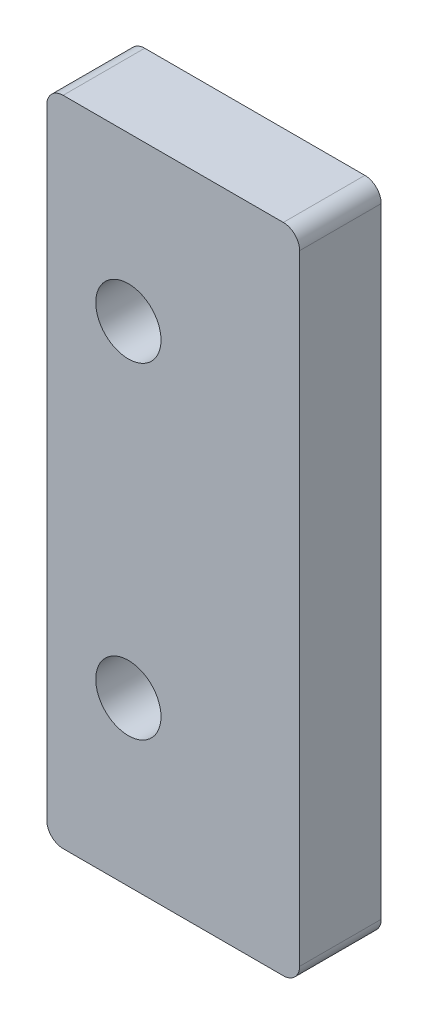
ISO-10303-21;
HEADER;
FILE_DESCRIPTION(('STEP AP214'),'2;1');
FILE_NAME('part.step','',(''),(''),'','','');
FILE_SCHEMA(('AUTOMOTIVE_DESIGN { 1 0 10303 214 1 1 1 1 }'));
ENDSEC;
DATA;
#1=APPLICATION_CONTEXT('core data for automotive mechanical design processes');
#2=APPLICATION_PROTOCOL_DEFINITION('international standard','automotive_design',2000,#1);
#3=PRODUCT_CONTEXT('',#1,'mechanical');
#4=PRODUCT('Part','Part','',(#3));
#5=PRODUCT_RELATED_PRODUCT_CATEGORY('part','',(#4));
#6=PRODUCT_DEFINITION_FORMATION('','',#4);
#7=PRODUCT_DEFINITION_CONTEXT('part definition',#1,'design');
#8=PRODUCT_DEFINITION('design','',#6,#7);
#9=PRODUCT_DEFINITION_SHAPE('','',#8);
#10=(LENGTH_UNIT() NAMED_UNIT(*) SI_UNIT(.MILLI.,.METRE.));
#11=(NAMED_UNIT(*) PLANE_ANGLE_UNIT() SI_UNIT($,.RADIAN.));
#12=(NAMED_UNIT(*) SI_UNIT($,.STERADIAN.) SOLID_ANGLE_UNIT());
#13=UNCERTAINTY_MEASURE_WITH_UNIT(LENGTH_MEASURE(1.E-05),#10,'distance_accuracy_value','');
#14=(GEOMETRIC_REPRESENTATION_CONTEXT(3) GLOBAL_UNCERTAINTY_ASSIGNED_CONTEXT((#13)) GLOBAL_UNIT_ASSIGNED_CONTEXT((#10,
#11,#12)) REPRESENTATION_CONTEXT('',''));
#15=CARTESIAN_POINT('',(0.,0.,0.));
#16=DIRECTION('',(0.,0.,1.));
#17=DIRECTION('',(1.,0.,0.));
#18=AXIS2_PLACEMENT_3D('',#15,#16,#17);
#19=CARTESIAN_POINT('',(0.,0.,5.));
#20=DIRECTION('',(0.,0.,-1.));
#21=DIRECTION('',(-1.,0.,0.));
#22=AXIS2_PLACEMENT_3D('',#19,#20,#21);
#23=PLANE('',#22);
#24=DIRECTION('',(1.,0.,0.));
#25=VECTOR('',#24,1.);
#26=CARTESIAN_POINT('',(0.,0.,5.));
#27=LINE('',#26,#25);
#28=CARTESIAN_POINT('',(1.,0.,5.));
#29=VERTEX_POINT('',#28);
#30=CARTESIAN_POINT('',(14.5,0.,5.));
#31=VERTEX_POINT('',#30);
#32=EDGE_CURVE('E169',#29,#31,#27,.T.);
#33=ORIENTED_EDGE('',*,*,#32,.T.);
#34=CARTESIAN_POINT('',(14.5,1.,5.));
#35=DIRECTION('',(0.,0.,-1.));
#36=DIRECTION('',(-1.,0.,0.));
#37=AXIS2_PLACEMENT_3D('',#34,#35,#36);
#38=CIRCLE('',#37,1.);
#39=CARTESIAN_POINT('',(15.5,1.,5.));
#40=VERTEX_POINT('',#39);
#41=EDGE_CURVE('E147',#31,#40,#38,.F.);
#42=ORIENTED_EDGE('',*,*,#41,.T.);
#43=DIRECTION('',(0.,1.,0.));
#44=VECTOR('',#43,1.);
#45=CARTESIAN_POINT('',(15.5,0.,5.));
#46=LINE('',#45,#44);
#47=CARTESIAN_POINT('',(15.5,39.,5.));
#48=VERTEX_POINT('',#47);
#49=EDGE_CURVE('E117',#40,#48,#46,.T.);
#50=ORIENTED_EDGE('',*,*,#49,.T.);
#51=CARTESIAN_POINT('',(14.5,39.,5.));
#52=DIRECTION('',(0.,0.,-1.));
#53=DIRECTION('',(-1.,0.,0.));
#54=AXIS2_PLACEMENT_3D('',#51,#52,#53);
#55=CIRCLE('',#54,1.);
#56=CARTESIAN_POINT('',(14.5,40.,5.));
#57=VERTEX_POINT('',#56);
#58=EDGE_CURVE('E53',#48,#57,#55,.F.);
#59=ORIENTED_EDGE('',*,*,#58,.T.);
#60=DIRECTION('',(-1.,0.,0.));
#61=VECTOR('',#60,1.);
#62=CARTESIAN_POINT('',(0.,40.,5.));
#63=LINE('',#62,#61);
#64=CARTESIAN_POINT('',(1.,40.,5.));
#65=VERTEX_POINT('',#64);
#66=EDGE_CURVE('E133',#57,#65,#63,.T.);
#67=ORIENTED_EDGE('',*,*,#66,.T.);
#68=CARTESIAN_POINT('',(1.,39.,5.));
#69=DIRECTION('',(0.,0.,-1.));
#70=DIRECTION('',(-1.,0.,0.));
#71=AXIS2_PLACEMENT_3D('',#68,#69,#70);
#72=CIRCLE('',#71,1.);
#73=CARTESIAN_POINT('',(0.,39.,5.));
#74=VERTEX_POINT('',#73);
#75=EDGE_CURVE('E143',#65,#74,#72,.F.);
#76=ORIENTED_EDGE('',*,*,#75,.T.);
#77=DIRECTION('',(0.,-1.,0.));
#78=VECTOR('',#77,1.);
#79=CARTESIAN_POINT('',(0.,0.,5.));
#80=LINE('',#79,#78);
#81=CARTESIAN_POINT('',(0.,1.,5.));
#82=VERTEX_POINT('',#81);
#83=EDGE_CURVE('E127',#74,#82,#80,.T.);
#84=ORIENTED_EDGE('',*,*,#83,.T.);
#85=CARTESIAN_POINT('',(1.,1.,5.));
#86=DIRECTION('',(0.,0.,-1.));
#87=DIRECTION('',(-1.,0.,0.));
#88=AXIS2_PLACEMENT_3D('',#85,#86,#87);
#89=CIRCLE('',#88,1.);
#90=EDGE_CURVE('E145',#82,#29,#89,.F.);
#91=ORIENTED_EDGE('',*,*,#90,.T.);
#92=EDGE_LOOP('',(#33,#42,#50,#59,#67,#76,#84,#91));
#93=FACE_BOUND('',#92,.T.);
#94=CARTESIAN_POINT('',(5.,10.,5.));
#95=DIRECTION('',(0.,0.,1.));
#96=DIRECTION('',(1.,0.,0.));
#97=AXIS2_PLACEMENT_3D('',#94,#95,#96);
#98=CIRCLE('',#97,2.);
#99=CARTESIAN_POINT('',(7.,10.,5.));
#100=VERTEX_POINT('',#99);
#101=EDGE_CURVE('E178',#100,#100,#98,.T.);
#102=ORIENTED_EDGE('',*,*,#101,.F.);
#103=EDGE_LOOP('',(#102));
#104=FACE_BOUND('',#103,.T.);
#105=CARTESIAN_POINT('',(5.,30.,5.));
#106=DIRECTION('',(0.,0.,1.));
#107=DIRECTION('',(1.,0.,0.));
#108=AXIS2_PLACEMENT_3D('',#105,#106,#107);
#109=CIRCLE('',#108,2.);
#110=CARTESIAN_POINT('',(7.,30.,5.));
#111=VERTEX_POINT('',#110);
#112=EDGE_CURVE('E183',#111,#111,#109,.T.);
#113=ORIENTED_EDGE('',*,*,#112,.F.);
#114=EDGE_LOOP('',(#113));
#115=FACE_BOUND('',#114,.T.);
#116=ADVANCED_FACE('F33',(#93,#104,#115),#23,.F.);
#117=CARTESIAN_POINT('',(0.,0.,0.));
#118=DIRECTION('',(0.,0.,-1.));
#119=DIRECTION('',(-1.,0.,0.));
#120=AXIS2_PLACEMENT_3D('',#117,#118,#119);
#121=PLANE('',#120);
#122=CARTESIAN_POINT('',(5.,10.,0.));
#123=DIRECTION('',(0.,0.,1.));
#124=DIRECTION('',(1.,0.,0.));
#125=AXIS2_PLACEMENT_3D('',#122,#123,#124);
#126=CIRCLE('',#125,2.);
#127=CARTESIAN_POINT('',(7.,10.,0.));
#128=VERTEX_POINT('',#127);
#129=EDGE_CURVE('E174',#128,#128,#126,.T.);
#130=ORIENTED_EDGE('',*,*,#129,.T.);
#131=EDGE_LOOP('',(#130));
#132=FACE_BOUND('',#131,.T.);
#133=DIRECTION('',(0.,1.,0.));
#134=VECTOR('',#133,1.);
#135=CARTESIAN_POINT('',(15.5,0.,0.));
#136=LINE('',#135,#134);
#137=CARTESIAN_POINT('',(15.5,1.,0.));
#138=VERTEX_POINT('',#137);
#139=CARTESIAN_POINT('',(15.5,39.,0.));
#140=VERTEX_POINT('',#139);
#141=EDGE_CURVE('E115',#138,#140,#136,.T.);
#142=ORIENTED_EDGE('',*,*,#141,.F.);
#143=CARTESIAN_POINT('',(14.5,1.,0.));
#144=DIRECTION('',(0.,0.,-1.));
#145=DIRECTION('',(-1.,0.,0.));
#146=AXIS2_PLACEMENT_3D('',#143,#144,#145);
#147=CIRCLE('',#146,1.);
#148=CARTESIAN_POINT('',(14.5,0.,0.));
#149=VERTEX_POINT('',#148);
#150=EDGE_CURVE('E98',#138,#149,#147,.T.);
#151=ORIENTED_EDGE('',*,*,#150,.T.);
#152=DIRECTION('',(1.,0.,0.));
#153=VECTOR('',#152,1.);
#154=CARTESIAN_POINT('',(0.,0.,0.));
#155=LINE('',#154,#153);
#156=CARTESIAN_POINT('',(1.,0.,0.));
#157=VERTEX_POINT('',#156);
#158=EDGE_CURVE('E125',#157,#149,#155,.T.);
#159=ORIENTED_EDGE('',*,*,#158,.F.);
#160=CARTESIAN_POINT('',(1.,1.,0.));
#161=DIRECTION('',(0.,0.,-1.));
#162=DIRECTION('',(-1.,0.,0.));
#163=AXIS2_PLACEMENT_3D('',#160,#161,#162);
#164=CIRCLE('',#163,1.);
#165=CARTESIAN_POINT('',(0.,1.,0.));
#166=VERTEX_POINT('',#165);
#167=EDGE_CURVE('E109',#157,#166,#164,.T.);
#168=ORIENTED_EDGE('',*,*,#167,.T.);
#169=DIRECTION('',(0.,-1.,0.));
#170=VECTOR('',#169,1.);
#171=CARTESIAN_POINT('',(0.,0.,0.));
#172=LINE('',#171,#170);
#173=CARTESIAN_POINT('',(0.,39.,0.));
#174=VERTEX_POINT('',#173);
#175=EDGE_CURVE('E129',#174,#166,#172,.T.);
#176=ORIENTED_EDGE('',*,*,#175,.F.);
#177=CARTESIAN_POINT('',(1.,39.,0.));
#178=DIRECTION('',(0.,0.,-1.));
#179=DIRECTION('',(-1.,0.,0.));
#180=AXIS2_PLACEMENT_3D('',#177,#178,#179);
#181=CIRCLE('',#180,1.);
#182=CARTESIAN_POINT('',(1.,40.,0.));
#183=VERTEX_POINT('',#182);
#184=EDGE_CURVE('E136',#174,#183,#181,.T.);
#185=ORIENTED_EDGE('',*,*,#184,.T.);
#186=DIRECTION('',(-1.,0.,0.));
#187=VECTOR('',#186,1.);
#188=CARTESIAN_POINT('',(0.,40.,0.));
#189=LINE('',#188,#187);
#190=CARTESIAN_POINT('',(14.5,40.,0.));
#191=VERTEX_POINT('',#190);
#192=EDGE_CURVE('E124',#191,#183,#189,.T.);
#193=ORIENTED_EDGE('',*,*,#192,.F.);
#194=CARTESIAN_POINT('',(14.5,39.,0.));
#195=DIRECTION('',(0.,0.,-1.));
#196=DIRECTION('',(-1.,0.,0.));
#197=AXIS2_PLACEMENT_3D('',#194,#195,#196);
#198=CIRCLE('',#197,1.);
#199=EDGE_CURVE('E118',#191,#140,#198,.T.);
#200=ORIENTED_EDGE('',*,*,#199,.T.);
#201=EDGE_LOOP('',(#142,#151,#159,#168,#176,#185,#193,#200));
#202=FACE_BOUND('',#201,.T.);
#203=CARTESIAN_POINT('',(5.,30.,0.));
#204=DIRECTION('',(0.,0.,1.));
#205=DIRECTION('',(1.,0.,0.));
#206=AXIS2_PLACEMENT_3D('',#203,#204,#205);
#207=CIRCLE('',#206,2.);
#208=CARTESIAN_POINT('',(7.,30.,0.));
#209=VERTEX_POINT('',#208);
#210=EDGE_CURVE('E185',#209,#209,#207,.T.);
#211=ORIENTED_EDGE('',*,*,#210,.T.);
#212=EDGE_LOOP('',(#211));
#213=FACE_BOUND('',#212,.T.);
#214=ADVANCED_FACE('F121',(#132,#202,#213),#121,.T.);
#215=CARTESIAN_POINT('',(0.,0.,5.));
#216=DIRECTION('',(1.,0.,0.));
#217=DIRECTION('',(0.,0.,-1.));
#218=AXIS2_PLACEMENT_3D('',#215,#216,#217);
#219=PLANE('',#218);
#220=ORIENTED_EDGE('',*,*,#175,.T.);
#221=DIRECTION('',(0.,0.,-1.));
#222=VECTOR('',#221,1.);
#223=CARTESIAN_POINT('',(0.,1.,5.));
#224=LINE('',#223,#222);
#225=EDGE_CURVE('E152',#166,#82,#224,.F.);
#226=ORIENTED_EDGE('',*,*,#225,.T.);
#227=ORIENTED_EDGE('',*,*,#83,.F.);
#228=DIRECTION('',(0.,0.,-1.));
#229=VECTOR('',#228,1.);
#230=CARTESIAN_POINT('',(0.,39.,5.));
#231=LINE('',#230,#229);
#232=EDGE_CURVE('E149',#74,#174,#231,.T.);
#233=ORIENTED_EDGE('',*,*,#232,.T.);
#234=EDGE_LOOP('',(#220,#226,#227,#233));
#235=FACE_BOUND('',#234,.T.);
#236=ADVANCED_FACE('F165',(#235),#219,.F.);
#237=CARTESIAN_POINT('',(0.,0.,5.));
#238=DIRECTION('',(0.,1.,0.));
#239=DIRECTION('',(0.,0.,1.));
#240=AXIS2_PLACEMENT_3D('',#237,#238,#239);
#241=PLANE('',#240);
#242=ORIENTED_EDGE('',*,*,#158,.T.);
#243=DIRECTION('',(0.,0.,-1.));
#244=VECTOR('',#243,1.);
#245=CARTESIAN_POINT('',(14.5,0.,5.));
#246=LINE('',#245,#244);
#247=EDGE_CURVE('E103',#149,#31,#246,.F.);
#248=ORIENTED_EDGE('',*,*,#247,.T.);
#249=ORIENTED_EDGE('',*,*,#32,.F.);
#250=DIRECTION('',(0.,0.,-1.));
#251=VECTOR('',#250,1.);
#252=CARTESIAN_POINT('',(1.,0.,5.));
#253=LINE('',#252,#251);
#254=EDGE_CURVE('E108',#29,#157,#253,.T.);
#255=ORIENTED_EDGE('',*,*,#254,.T.);
#256=EDGE_LOOP('',(#242,#248,#249,#255));
#257=FACE_BOUND('',#256,.T.);
#258=ADVANCED_FACE('F210',(#257),#241,.F.);
#259=CARTESIAN_POINT('',(15.5,0.,5.));
#260=DIRECTION('',(-1.,0.,0.));
#261=DIRECTION('',(0.,0.,1.));
#262=AXIS2_PLACEMENT_3D('',#259,#260,#261);
#263=PLANE('',#262);
#264=ORIENTED_EDGE('',*,*,#49,.F.);
#265=DIRECTION('',(0.,0.,-1.));
#266=VECTOR('',#265,1.);
#267=CARTESIAN_POINT('',(15.5,1.,5.));
#268=LINE('',#267,#266);
#269=EDGE_CURVE('E102',#40,#138,#268,.T.);
#270=ORIENTED_EDGE('',*,*,#269,.T.);
#271=ORIENTED_EDGE('',*,*,#141,.T.);
#272=DIRECTION('',(0.,0.,-1.));
#273=VECTOR('',#272,1.);
#274=CARTESIAN_POINT('',(15.5,39.,5.));
#275=LINE('',#274,#273);
#276=EDGE_CURVE('E119',#140,#48,#275,.F.);
#277=ORIENTED_EDGE('',*,*,#276,.T.);
#278=EDGE_LOOP('',(#264,#270,#271,#277));
#279=FACE_BOUND('',#278,.T.);
#280=ADVANCED_FACE('F114',(#279),#263,.F.);
#281=CARTESIAN_POINT('',(0.,40.,5.));
#282=DIRECTION('',(0.,-1.,0.));
#283=DIRECTION('',(0.,0.,-1.));
#284=AXIS2_PLACEMENT_3D('',#281,#282,#283);
#285=PLANE('',#284);
#286=ORIENTED_EDGE('',*,*,#192,.T.);
#287=DIRECTION('',(0.,0.,-1.));
#288=VECTOR('',#287,1.);
#289=CARTESIAN_POINT('',(1.,40.,5.));
#290=LINE('',#289,#288);
#291=EDGE_CURVE('E11',#183,#65,#290,.F.);
#292=ORIENTED_EDGE('',*,*,#291,.T.);
#293=ORIENTED_EDGE('',*,*,#66,.F.);
#294=DIRECTION('',(0.,0.,-1.));
#295=VECTOR('',#294,1.);
#296=CARTESIAN_POINT('',(14.5,40.,5.));
#297=LINE('',#296,#295);
#298=EDGE_CURVE('E41',#57,#191,#297,.T.);
#299=ORIENTED_EDGE('',*,*,#298,.T.);
#300=EDGE_LOOP('',(#286,#292,#293,#299));
#301=FACE_BOUND('',#300,.T.);
#302=ADVANCED_FACE('F155',(#301),#285,.F.);
#303=CARTESIAN_POINT('',(5.,10.,5.));
#304=DIRECTION('',(0.,0.,-1.));
#305=DIRECTION('',(-1.,0.,0.));
#306=AXIS2_PLACEMENT_3D('',#303,#304,#305);
#307=CYLINDRICAL_SURFACE('',#306,2.);
#308=ORIENTED_EDGE('',*,*,#101,.T.);
#309=EDGE_LOOP('',(#308));
#310=FACE_BOUND('',#309,.T.);
#311=ORIENTED_EDGE('',*,*,#129,.F.);
#312=EDGE_LOOP('',(#311));
#313=FACE_BOUND('',#312,.T.);
#314=ADVANCED_FACE('F203',(#310,#313),#307,.F.);
#315=CARTESIAN_POINT('',(5.,30.,5.));
#316=DIRECTION('',(0.,0.,-1.));
#317=DIRECTION('',(-1.,0.,0.));
#318=AXIS2_PLACEMENT_3D('',#315,#316,#317);
#319=CYLINDRICAL_SURFACE('',#318,2.);
#320=ORIENTED_EDGE('',*,*,#112,.T.);
#321=EDGE_LOOP('',(#320));
#322=FACE_BOUND('',#321,.T.);
#323=ORIENTED_EDGE('',*,*,#210,.F.);
#324=EDGE_LOOP('',(#323));
#325=FACE_BOUND('',#324,.T.);
#326=ADVANCED_FACE('F191',(#322,#325),#319,.F.);
#327=CARTESIAN_POINT('',(14.5,1.,5.));
#328=DIRECTION('',(0.,0.,-1.));
#329=DIRECTION('',(-1.,0.,0.));
#330=AXIS2_PLACEMENT_3D('',#327,#328,#329);
#331=CYLINDRICAL_SURFACE('',#330,1.);
#332=ORIENTED_EDGE('',*,*,#41,.F.);
#333=ORIENTED_EDGE('',*,*,#247,.F.);
#334=ORIENTED_EDGE('',*,*,#150,.F.);
#335=ORIENTED_EDGE('',*,*,#269,.F.);
#336=EDGE_LOOP('',(#332,#333,#334,#335));
#337=FACE_BOUND('',#336,.T.);
#338=ADVANCED_FACE('F101',(#337),#331,.T.);
#339=CARTESIAN_POINT('',(1.,1.,5.));
#340=DIRECTION('',(0.,0.,-1.));
#341=DIRECTION('',(-1.,0.,0.));
#342=AXIS2_PLACEMENT_3D('',#339,#340,#341);
#343=CYLINDRICAL_SURFACE('',#342,1.);
#344=ORIENTED_EDGE('',*,*,#90,.F.);
#345=ORIENTED_EDGE('',*,*,#225,.F.);
#346=ORIENTED_EDGE('',*,*,#167,.F.);
#347=ORIENTED_EDGE('',*,*,#254,.F.);
#348=EDGE_LOOP('',(#344,#345,#346,#347));
#349=FACE_BOUND('',#348,.T.);
#350=ADVANCED_FACE('F218',(#349),#343,.T.);
#351=CARTESIAN_POINT('',(1.,39.,5.));
#352=DIRECTION('',(0.,0.,-1.));
#353=DIRECTION('',(-1.,0.,0.));
#354=AXIS2_PLACEMENT_3D('',#351,#352,#353);
#355=CYLINDRICAL_SURFACE('',#354,1.);
#356=ORIENTED_EDGE('',*,*,#75,.F.);
#357=ORIENTED_EDGE('',*,*,#291,.F.);
#358=ORIENTED_EDGE('',*,*,#184,.F.);
#359=ORIENTED_EDGE('',*,*,#232,.F.);
#360=EDGE_LOOP('',(#356,#357,#358,#359));
#361=FACE_BOUND('',#360,.T.);
#362=ADVANCED_FACE('F162',(#361),#355,.T.);
#363=CARTESIAN_POINT('',(14.5,39.,5.));
#364=DIRECTION('',(0.,0.,-1.));
#365=DIRECTION('',(-1.,0.,0.));
#366=AXIS2_PLACEMENT_3D('',#363,#364,#365);
#367=CYLINDRICAL_SURFACE('',#366,1.);
#368=ORIENTED_EDGE('',*,*,#58,.F.);
#369=ORIENTED_EDGE('',*,*,#276,.F.);
#370=ORIENTED_EDGE('',*,*,#199,.F.);
#371=ORIENTED_EDGE('',*,*,#298,.F.);
#372=EDGE_LOOP('',(#368,#369,#370,#371));
#373=FACE_BOUND('',#372,.T.);
#374=ADVANCED_FACE('F35',(#373),#367,.T.);
#375=CLOSED_SHELL('',(#116,#214,#236,#258,#280,#302,#314,#326,#338,#350,#362,#374));
#376=MANIFOLD_SOLID_BREP('B2',#375);
#377=ADVANCED_BREP_SHAPE_REPRESENTATION('',(#18,#376),#14);
#378=SHAPE_DEFINITION_REPRESENTATION(#9,#377);
ENDSEC;
END-ISO-10303-21;
